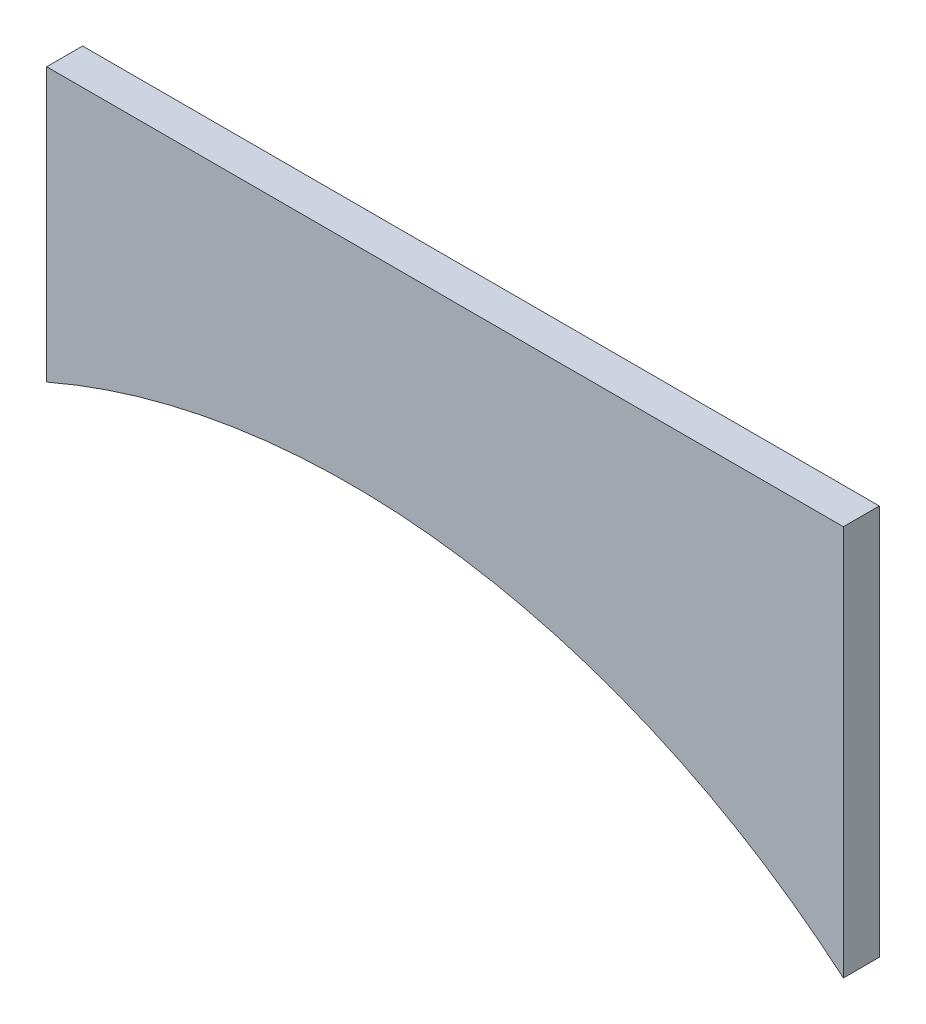
ISO-10303-21;
HEADER;
FILE_DESCRIPTION(('STEP AP214'),'2;1');
FILE_NAME('part.step','',(''),(''),'','','');
FILE_SCHEMA(('AUTOMOTIVE_DESIGN { 1 0 10303 214 1 1 1 1 }'));
ENDSEC;
DATA;
#1=APPLICATION_CONTEXT('core data for automotive mechanical design processes');
#2=APPLICATION_PROTOCOL_DEFINITION('international standard','automotive_design',2000,#1);
#3=PRODUCT_CONTEXT('',#1,'mechanical');
#4=PRODUCT('Part','Part','',(#3));
#5=PRODUCT_RELATED_PRODUCT_CATEGORY('part','',(#4));
#6=PRODUCT_DEFINITION_FORMATION('','',#4);
#7=PRODUCT_DEFINITION_CONTEXT('part definition',#1,'design');
#8=PRODUCT_DEFINITION('design','',#6,#7);
#9=PRODUCT_DEFINITION_SHAPE('','',#8);
#10=(LENGTH_UNIT() NAMED_UNIT(*) SI_UNIT(.MILLI.,.METRE.));
#11=(NAMED_UNIT(*) PLANE_ANGLE_UNIT() SI_UNIT($,.RADIAN.));
#12=(NAMED_UNIT(*) SI_UNIT($,.STERADIAN.) SOLID_ANGLE_UNIT());
#13=UNCERTAINTY_MEASURE_WITH_UNIT(LENGTH_MEASURE(1.E-05),#10,'distance_accuracy_value','');
#14=(GEOMETRIC_REPRESENTATION_CONTEXT(3) GLOBAL_UNCERTAINTY_ASSIGNED_CONTEXT((#13)) GLOBAL_UNIT_ASSIGNED_CONTEXT((#10,
#11,#12)) REPRESENTATION_CONTEXT('',''));
#15=CARTESIAN_POINT('',(0.,0.,0.));
#16=DIRECTION('',(0.,0.,1.));
#17=DIRECTION('',(1.,0.,0.));
#18=AXIS2_PLACEMENT_3D('',#15,#16,#17);
#19=CARTESIAN_POINT('',(0.,0.,3.));
#20=DIRECTION('',(1.,0.,0.));
#21=DIRECTION('',(0.,0.,-1.));
#22=AXIS2_PLACEMENT_3D('',#19,#20,#21);
#23=PLANE('',#22);
#24=DIRECTION('',(0.,-1.,0.));
#25=VECTOR('',#24,1.);
#26=CARTESIAN_POINT('',(0.,0.,0.));
#27=LINE('',#26,#25);
#28=CARTESIAN_POINT('',(0.,45.72,0.));
#29=VERTEX_POINT('',#28);
#30=CARTESIAN_POINT('',(0.,22.9087113259392,0.));
#31=VERTEX_POINT('',#30);
#32=EDGE_CURVE('E89',#29,#31,#27,.T.);
#33=ORIENTED_EDGE('',*,*,#32,.T.);
#34=DIRECTION('',(0.,0.,1.));
#35=VECTOR('',#34,1.);
#36=CARTESIAN_POINT('',(0.,22.9087113259392,0.));
#37=LINE('',#36,#35);
#38=CARTESIAN_POINT('',(0.,22.9087113259392,3.));
#39=VERTEX_POINT('',#38);
#40=EDGE_CURVE('E54',#31,#39,#37,.T.);
#41=ORIENTED_EDGE('',*,*,#40,.T.);
#42=DIRECTION('',(0.,-1.,0.));
#43=VECTOR('',#42,1.);
#44=CARTESIAN_POINT('',(0.,0.,3.));
#45=LINE('',#44,#43);
#46=CARTESIAN_POINT('',(0.,45.72,3.));
#47=VERTEX_POINT('',#46);
#48=EDGE_CURVE('E84',#47,#39,#45,.T.);
#49=ORIENTED_EDGE('',*,*,#48,.F.);
#50=DIRECTION('',(0.,0.,-1.));
#51=VECTOR('',#50,1.);
#52=CARTESIAN_POINT('',(0.,45.72,3.));
#53=LINE('',#52,#51);
#54=EDGE_CURVE('E47',#47,#29,#53,.T.);
#55=ORIENTED_EDGE('',*,*,#54,.T.);
#56=EDGE_LOOP('',(#33,#41,#49,#55));
#57=FACE_BOUND('',#56,.T.);
#58=ADVANCED_FACE('F39',(#57),#23,.F.);
#59=CARTESIAN_POINT('',(66.548,0.,3.));
#60=DIRECTION('',(-1.,0.,0.));
#61=DIRECTION('',(0.,0.,1.));
#62=AXIS2_PLACEMENT_3D('',#59,#60,#61);
#63=PLANE('',#62);
#64=DIRECTION('',(0.,1.,0.));
#65=VECTOR('',#64,1.);
#66=CARTESIAN_POINT('',(66.548,0.,3.));
#67=LINE('',#66,#65);
#68=CARTESIAN_POINT('',(66.548,13.074161276714,3.));
#69=VERTEX_POINT('',#68);
#70=CARTESIAN_POINT('',(66.548,45.72,3.));
#71=VERTEX_POINT('',#70);
#72=EDGE_CURVE('E103',#69,#71,#67,.T.);
#73=ORIENTED_EDGE('',*,*,#72,.F.);
#74=DIRECTION('',(0.,0.,1.));
#75=VECTOR('',#74,1.);
#76=CARTESIAN_POINT('',(66.548,13.074161276714,0.));
#77=LINE('',#76,#75);
#78=CARTESIAN_POINT('',(66.548,13.074161276714,0.));
#79=VERTEX_POINT('',#78);
#80=EDGE_CURVE('E98',#69,#79,#77,.F.);
#81=ORIENTED_EDGE('',*,*,#80,.T.);
#82=DIRECTION('',(0.,1.,0.));
#83=VECTOR('',#82,1.);
#84=CARTESIAN_POINT('',(66.548,0.,0.));
#85=LINE('',#84,#83);
#86=CARTESIAN_POINT('',(66.548,45.72,0.));
#87=VERTEX_POINT('',#86);
#88=EDGE_CURVE('E85',#79,#87,#85,.T.);
#89=ORIENTED_EDGE('',*,*,#88,.T.);
#90=DIRECTION('',(0.,0.,-1.));
#91=VECTOR('',#90,1.);
#92=CARTESIAN_POINT('',(66.548,45.72,3.));
#93=LINE('',#92,#91);
#94=EDGE_CURVE('E11',#71,#87,#93,.T.);
#95=ORIENTED_EDGE('',*,*,#94,.F.);
#96=EDGE_LOOP('',(#73,#81,#89,#95));
#97=FACE_BOUND('',#96,.T.);
#98=ADVANCED_FACE('F128',(#97),#63,.F.);
#99=CARTESIAN_POINT('',(0.,45.72,3.));
#100=DIRECTION('',(0.,-1.,0.));
#101=DIRECTION('',(0.,0.,-1.));
#102=AXIS2_PLACEMENT_3D('',#99,#100,#101);
#103=PLANE('',#102);
#104=DIRECTION('',(-1.,0.,0.));
#105=VECTOR('',#104,1.);
#106=CARTESIAN_POINT('',(0.,45.72,0.));
#107=LINE('',#106,#105);
#108=EDGE_CURVE('E75',#87,#29,#107,.T.);
#109=ORIENTED_EDGE('',*,*,#108,.T.);
#110=ORIENTED_EDGE('',*,*,#54,.F.);
#111=DIRECTION('',(-1.,0.,0.));
#112=VECTOR('',#111,1.);
#113=CARTESIAN_POINT('',(0.,45.72,3.));
#114=LINE('',#113,#112);
#115=EDGE_CURVE('E63',#71,#47,#114,.T.);
#116=ORIENTED_EDGE('',*,*,#115,.F.);
#117=ORIENTED_EDGE('',*,*,#94,.T.);
#118=EDGE_LOOP('',(#109,#110,#116,#117));
#119=FACE_BOUND('',#118,.T.);
#120=ADVANCED_FACE('F77',(#119),#103,.F.);
#121=CARTESIAN_POINT('',(0.,0.,3.));
#122=DIRECTION('',(0.,0.,-1.));
#123=DIRECTION('',(-1.,0.,0.));
#124=AXIS2_PLACEMENT_3D('',#121,#122,#123);
#125=PLANE('',#124);
#126=ORIENTED_EDGE('',*,*,#48,.T.);
#127=CARTESIAN_POINT('',(25.4,-35.29,3.));
#128=DIRECTION('',(0.,0.,1.));
#129=DIRECTION('',(1.,0.,0.));
#130=AXIS2_PLACEMENT_3D('',#127,#128,#129);
#131=CIRCLE('',#130,63.5);
#132=EDGE_CURVE('E111',#69,#39,#131,.T.);
#133=ORIENTED_EDGE('',*,*,#132,.F.);
#134=ORIENTED_EDGE('',*,*,#72,.T.);
#135=ORIENTED_EDGE('',*,*,#115,.T.);
#136=EDGE_LOOP('',(#126,#133,#134,#135));
#137=FACE_BOUND('',#136,.T.);
#138=ADVANCED_FACE('F120',(#137),#125,.F.);
#139=CARTESIAN_POINT('',(0.,0.,0.));
#140=DIRECTION('',(0.,0.,-1.));
#141=DIRECTION('',(-1.,0.,0.));
#142=AXIS2_PLACEMENT_3D('',#139,#140,#141);
#143=PLANE('',#142);
#144=CARTESIAN_POINT('',(25.4,-35.29,0.));
#145=DIRECTION('',(0.,0.,1.));
#146=DIRECTION('',(1.,0.,0.));
#147=AXIS2_PLACEMENT_3D('',#144,#145,#146);
#148=CIRCLE('',#147,63.5);
#149=EDGE_CURVE('E92',#79,#31,#148,.T.);
#150=ORIENTED_EDGE('',*,*,#149,.T.);
#151=ORIENTED_EDGE('',*,*,#32,.F.);
#152=ORIENTED_EDGE('',*,*,#108,.F.);
#153=ORIENTED_EDGE('',*,*,#88,.F.);
#154=EDGE_LOOP('',(#150,#151,#152,#153));
#155=FACE_BOUND('',#154,.T.);
#156=ADVANCED_FACE('F91',(#155),#143,.T.);
#157=CARTESIAN_POINT('',(25.4,-35.29,0.));
#158=DIRECTION('',(0.,0.,1.));
#159=DIRECTION('',(1.,0.,0.));
#160=AXIS2_PLACEMENT_3D('',#157,#158,#159);
#161=CYLINDRICAL_SURFACE('',#160,63.5);
#162=ORIENTED_EDGE('',*,*,#149,.F.);
#163=ORIENTED_EDGE('',*,*,#80,.F.);
#164=ORIENTED_EDGE('',*,*,#132,.T.);
#165=ORIENTED_EDGE('',*,*,#40,.F.);
#166=EDGE_LOOP('',(#162,#163,#164,#165));
#167=FACE_BOUND('',#166,.T.);
#168=ADVANCED_FACE('F117',(#167),#161,.F.);
#169=CLOSED_SHELL('',(#58,#98,#120,#138,#156,#168));
#170=MANIFOLD_SOLID_BREP('B2',#169);
#171=ADVANCED_BREP_SHAPE_REPRESENTATION('',(#18,#170),#14);
#172=SHAPE_DEFINITION_REPRESENTATION(#9,#171);
ENDSEC;
END-ISO-10303-21;
